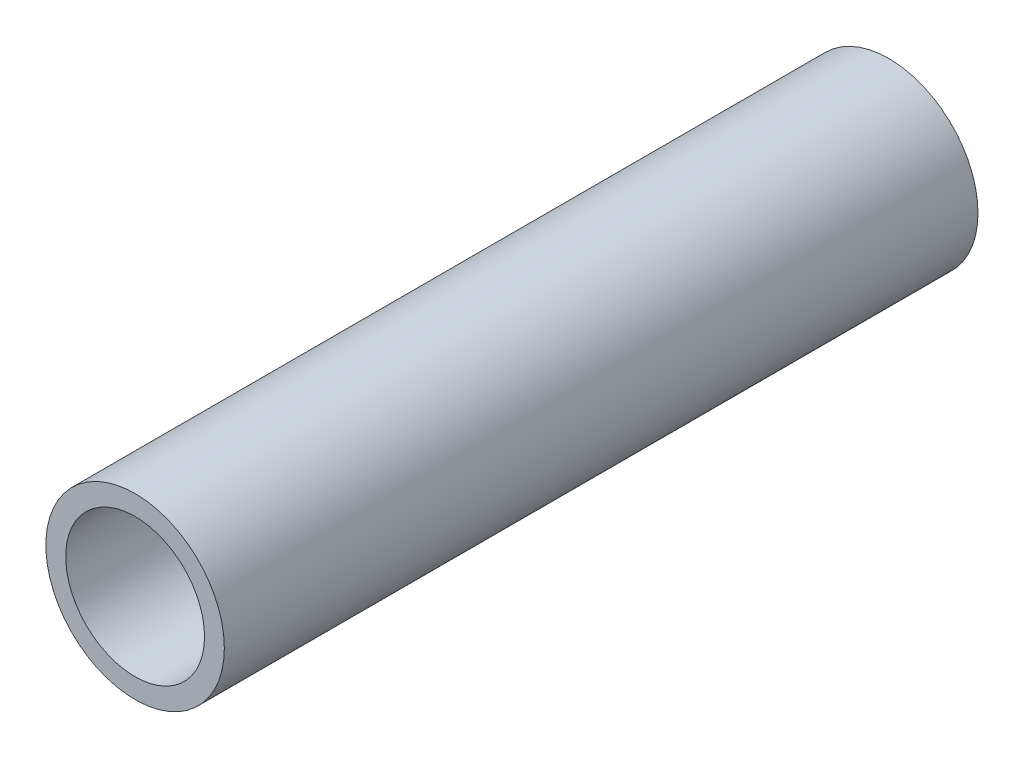
ISO-10303-21;
HEADER;
FILE_DESCRIPTION(('STEP AP214'),'2;1');
FILE_NAME('part.step','',(''),(''),'','','');
FILE_SCHEMA(('AUTOMOTIVE_DESIGN { 1 0 10303 214 1 1 1 1 }'));
ENDSEC;
DATA;
#1=APPLICATION_CONTEXT('core data for automotive mechanical design processes');
#2=APPLICATION_PROTOCOL_DEFINITION('international standard','automotive_design',2000,#1);
#3=PRODUCT_CONTEXT('',#1,'mechanical');
#4=PRODUCT('Part','Part','',(#3));
#5=PRODUCT_RELATED_PRODUCT_CATEGORY('part','',(#4));
#6=PRODUCT_DEFINITION_FORMATION('','',#4);
#7=PRODUCT_DEFINITION_CONTEXT('part definition',#1,'design');
#8=PRODUCT_DEFINITION('design','',#6,#7);
#9=PRODUCT_DEFINITION_SHAPE('','',#8);
#10=(LENGTH_UNIT() NAMED_UNIT(*) SI_UNIT(.MILLI.,.METRE.));
#11=(NAMED_UNIT(*) PLANE_ANGLE_UNIT() SI_UNIT($,.RADIAN.));
#12=(NAMED_UNIT(*) SI_UNIT($,.STERADIAN.) SOLID_ANGLE_UNIT());
#13=UNCERTAINTY_MEASURE_WITH_UNIT(LENGTH_MEASURE(1.E-05),#10,'distance_accuracy_value','');
#14=(GEOMETRIC_REPRESENTATION_CONTEXT(3) GLOBAL_UNCERTAINTY_ASSIGNED_CONTEXT((#13)) GLOBAL_UNIT_ASSIGNED_CONTEXT((#10,
#11,#12)) REPRESENTATION_CONTEXT('',''));
#15=CARTESIAN_POINT('',(0.,0.,0.));
#16=DIRECTION('',(0.,0.,1.));
#17=DIRECTION('',(1.,0.,0.));
#18=AXIS2_PLACEMENT_3D('',#15,#16,#17);
#19=CARTESIAN_POINT('',(0.,0.,76.));
#20=DIRECTION('',(0.,0.,1.));
#21=DIRECTION('',(1.,0.,0.));
#22=AXIS2_PLACEMENT_3D('',#19,#20,#21);
#23=PLANE('',#22);
#24=CARTESIAN_POINT('',(0.,0.,76.));
#25=DIRECTION('',(0.,0.,1.));
#26=DIRECTION('',(1.,0.,0.));
#27=AXIS2_PLACEMENT_3D('',#24,#25,#26);
#28=CIRCLE('',#27,9.);
#29=CARTESIAN_POINT('',(9.,0.,76.));
#30=VERTEX_POINT('',#29);
#31=EDGE_CURVE('E10',#30,#30,#28,.T.);
#32=ORIENTED_EDGE('',*,*,#31,.T.);
#33=EDGE_LOOP('',(#32));
#34=FACE_BOUND('',#33,.T.);
#35=CARTESIAN_POINT('',(0.,0.,76.));
#36=DIRECTION('',(0.,0.,1.));
#37=DIRECTION('',(1.,0.,0.));
#38=AXIS2_PLACEMENT_3D('',#35,#36,#37);
#39=CIRCLE('',#38,7.);
#40=CARTESIAN_POINT('',(7.,0.,76.));
#41=VERTEX_POINT('',#40);
#42=EDGE_CURVE('E56',#41,#41,#39,.T.);
#43=ORIENTED_EDGE('',*,*,#42,.F.);
#44=EDGE_LOOP('',(#43));
#45=FACE_BOUND('',#44,.T.);
#46=ADVANCED_FACE('F43',(#34,#45),#23,.T.);
#47=CARTESIAN_POINT('',(0.,0.,0.));
#48=DIRECTION('',(0.,0.,1.));
#49=DIRECTION('',(1.,0.,0.));
#50=AXIS2_PLACEMENT_3D('',#47,#48,#49);
#51=PLANE('',#50);
#52=CARTESIAN_POINT('',(0.,0.,0.));
#53=DIRECTION('',(0.,0.,1.));
#54=DIRECTION('',(1.,0.,0.));
#55=AXIS2_PLACEMENT_3D('',#52,#53,#54);
#56=CIRCLE('',#55,9.);
#57=CARTESIAN_POINT('',(9.,0.,0.));
#58=VERTEX_POINT('',#57);
#59=EDGE_CURVE('E47',#58,#58,#56,.T.);
#60=ORIENTED_EDGE('',*,*,#59,.F.);
#61=EDGE_LOOP('',(#60));
#62=FACE_BOUND('',#61,.T.);
#63=CARTESIAN_POINT('',(0.,0.,0.));
#64=DIRECTION('',(0.,0.,1.));
#65=DIRECTION('',(1.,0.,0.));
#66=AXIS2_PLACEMENT_3D('',#63,#64,#65);
#67=CIRCLE('',#66,7.);
#68=CARTESIAN_POINT('',(7.,0.,0.));
#69=VERTEX_POINT('',#68);
#70=EDGE_CURVE('E58',#69,#69,#67,.T.);
#71=ORIENTED_EDGE('',*,*,#70,.T.);
#72=EDGE_LOOP('',(#71));
#73=FACE_BOUND('',#72,.T.);
#74=ADVANCED_FACE('F70',(#62,#73),#51,.F.);
#75=CARTESIAN_POINT('',(0.,0.,76.));
#76=DIRECTION('',(0.,0.,-1.));
#77=DIRECTION('',(-1.,0.,0.));
#78=AXIS2_PLACEMENT_3D('',#75,#76,#77);
#79=CYLINDRICAL_SURFACE('',#78,9.);
#80=ORIENTED_EDGE('',*,*,#31,.F.);
#81=EDGE_LOOP('',(#80));
#82=FACE_BOUND('',#81,.T.);
#83=ORIENTED_EDGE('',*,*,#59,.T.);
#84=EDGE_LOOP('',(#83));
#85=FACE_BOUND('',#84,.T.);
#86=ADVANCED_FACE('F45',(#82,#85),#79,.T.);
#87=CARTESIAN_POINT('',(0.,0.,76.));
#88=DIRECTION('',(0.,0.,-1.));
#89=DIRECTION('',(-1.,0.,0.));
#90=AXIS2_PLACEMENT_3D('',#87,#88,#89);
#91=CYLINDRICAL_SURFACE('',#90,7.);
#92=ORIENTED_EDGE('',*,*,#42,.T.);
#93=EDGE_LOOP('',(#92));
#94=FACE_BOUND('',#93,.T.);
#95=ORIENTED_EDGE('',*,*,#70,.F.);
#96=EDGE_LOOP('',(#95));
#97=FACE_BOUND('',#96,.T.);
#98=ADVANCED_FACE('F66',(#94,#97),#91,.F.);
#99=CLOSED_SHELL('',(#46,#74,#86,#98));
#100=MANIFOLD_SOLID_BREP('B2',#99);
#101=ADVANCED_BREP_SHAPE_REPRESENTATION('',(#18,#100),#14);
#102=SHAPE_DEFINITION_REPRESENTATION(#9,#101);
ENDSEC;
END-ISO-10303-21;
